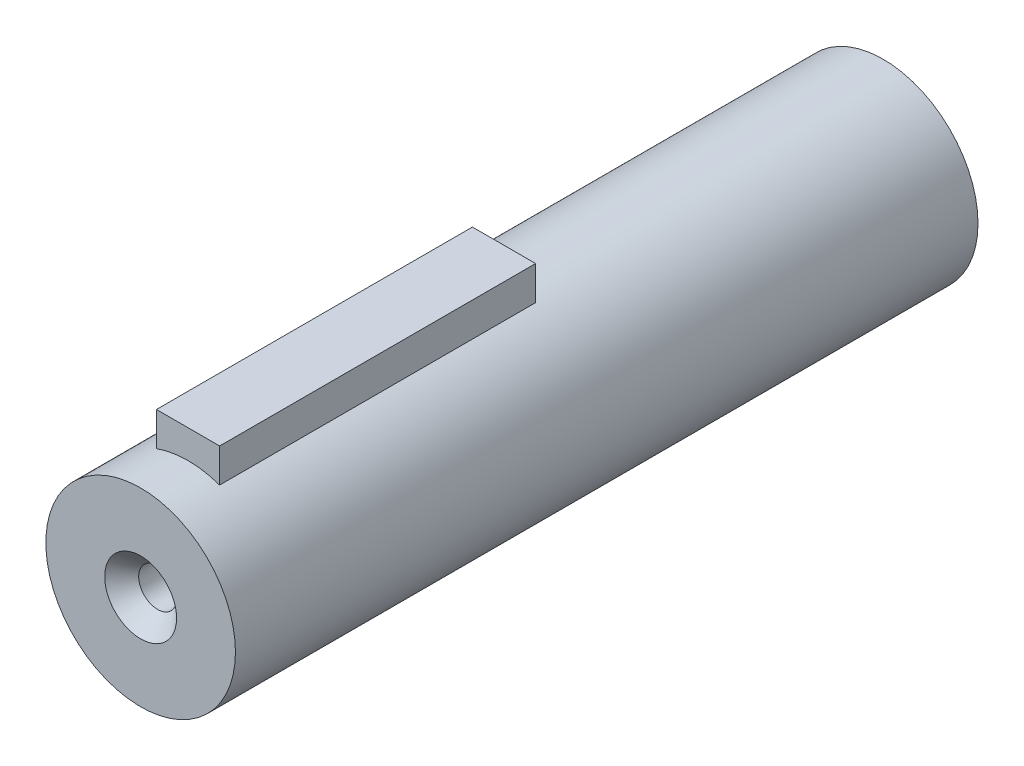
ISO-10303-21;
HEADER;
FILE_DESCRIPTION(('STEP AP214'),'2;1');
FILE_NAME('part.step','',(''),(''),'','','');
FILE_SCHEMA(('AUTOMOTIVE_DESIGN { 1 0 10303 214 1 1 1 1 }'));
ENDSEC;
DATA;
#1=APPLICATION_CONTEXT('core data for automotive mechanical design processes');
#2=APPLICATION_PROTOCOL_DEFINITION('international standard','automotive_design',2000,#1);
#3=PRODUCT_CONTEXT('',#1,'mechanical');
#4=PRODUCT('Part','Part','',(#3));
#5=PRODUCT_RELATED_PRODUCT_CATEGORY('part','',(#4));
#6=PRODUCT_DEFINITION_FORMATION('','',#4);
#7=PRODUCT_DEFINITION_CONTEXT('part definition',#1,'design');
#8=PRODUCT_DEFINITION('design','',#6,#7);
#9=PRODUCT_DEFINITION_SHAPE('','',#8);
#10=(LENGTH_UNIT() NAMED_UNIT(*) SI_UNIT(.MILLI.,.METRE.));
#11=(NAMED_UNIT(*) PLANE_ANGLE_UNIT() SI_UNIT($,.RADIAN.));
#12=(NAMED_UNIT(*) SI_UNIT($,.STERADIAN.) SOLID_ANGLE_UNIT());
#13=UNCERTAINTY_MEASURE_WITH_UNIT(LENGTH_MEASURE(1.E-05),#10,'distance_accuracy_value','');
#14=(GEOMETRIC_REPRESENTATION_CONTEXT(3) GLOBAL_UNCERTAINTY_ASSIGNED_CONTEXT((#13)) GLOBAL_UNIT_ASSIGNED_CONTEXT((#10,
#11,#12)) REPRESENTATION_CONTEXT('',''));
#15=CARTESIAN_POINT('',(0.,0.,0.));
#16=DIRECTION('',(0.,0.,1.));
#17=DIRECTION('',(1.,0.,0.));
#18=AXIS2_PLACEMENT_3D('',#15,#16,#17);
#19=CARTESIAN_POINT('',(0.,0.,47.));
#20=DIRECTION('',(0.,0.,-1.));
#21=DIRECTION('',(-1.,0.,0.));
#22=AXIS2_PLACEMENT_3D('',#19,#20,#21);
#23=CYLINDRICAL_SURFACE('',#22,6.);
#24=DIRECTION('',(0.,0.,-1.));
#25=VECTOR('',#24,1.);
#26=CARTESIAN_POINT('',(2.00000000000001,5.65685424949238,47.));
#27=LINE('',#26,#25);
#28=CARTESIAN_POINT('',(2.00000000000001,5.65685424949238,44.));
#29=VERTEX_POINT('',#28);
#30=CARTESIAN_POINT('',(2.00000000000001,5.65685424949238,24.));
#31=VERTEX_POINT('',#30);
#32=EDGE_CURVE('E108',#29,#31,#27,.T.);
#33=ORIENTED_EDGE('',*,*,#32,.F.);
#34=CARTESIAN_POINT('',(0.,0.,44.));
#35=DIRECTION('',(0.,0.,-1.));
#36=DIRECTION('',(-1.,0.,0.));
#37=AXIS2_PLACEMENT_3D('',#34,#35,#36);
#38=CIRCLE('',#37,6.);
#39=CARTESIAN_POINT('',(-1.99999999999999,5.65685424949238,44.));
#40=VERTEX_POINT('',#39);
#41=EDGE_CURVE('E109',#29,#40,#38,.F.);
#42=ORIENTED_EDGE('',*,*,#41,.T.);
#43=DIRECTION('',(0.,0.,-1.));
#44=VECTOR('',#43,1.);
#45=CARTESIAN_POINT('',(-1.99999999999999,5.65685424949238,47.));
#46=LINE('',#45,#44);
#47=CARTESIAN_POINT('',(-1.99999999999999,5.65685424949238,24.));
#48=VERTEX_POINT('',#47);
#49=EDGE_CURVE('E105',#40,#48,#46,.T.);
#50=ORIENTED_EDGE('',*,*,#49,.T.);
#51=CARTESIAN_POINT('',(0.,0.,24.));
#52=DIRECTION('',(0.,0.,-1.));
#53=DIRECTION('',(-1.,0.,0.));
#54=AXIS2_PLACEMENT_3D('',#51,#52,#53);
#55=CIRCLE('',#54,6.);
#56=EDGE_CURVE('E47',#31,#48,#55,.F.);
#57=ORIENTED_EDGE('',*,*,#56,.F.);
#58=EDGE_LOOP('',(#33,#42,#50,#57));
#59=FACE_BOUND('',#58,.T.);
#60=CARTESIAN_POINT('',(0.,0.,47.));
#61=DIRECTION('',(0.,0.,1.));
#62=DIRECTION('',(1.,0.,0.));
#63=AXIS2_PLACEMENT_3D('',#60,#61,#62);
#64=CIRCLE('',#63,6.);
#65=CARTESIAN_POINT('',(6.,0.,47.));
#66=VERTEX_POINT('',#65);
#67=EDGE_CURVE('E11',#66,#66,#64,.T.);
#68=ORIENTED_EDGE('',*,*,#67,.F.);
#69=EDGE_LOOP('',(#68));
#70=FACE_BOUND('',#69,.T.);
#71=CARTESIAN_POINT('',(0.,0.,0.));
#72=DIRECTION('',(0.,0.,1.));
#73=DIRECTION('',(1.,0.,0.));
#74=AXIS2_PLACEMENT_3D('',#71,#72,#73);
#75=CIRCLE('',#74,6.);
#76=CARTESIAN_POINT('',(6.,0.,0.));
#77=VERTEX_POINT('',#76);
#78=EDGE_CURVE('E36',#77,#77,#75,.T.);
#79=ORIENTED_EDGE('',*,*,#78,.T.);
#80=EDGE_LOOP('',(#79));
#81=FACE_BOUND('',#80,.T.);
#82=ADVANCED_FACE('F33',(#59,#70,#81),#23,.T.);
#83=CARTESIAN_POINT('',(0.,0.,47.));
#84=DIRECTION('',(0.,0.,1.));
#85=DIRECTION('',(1.,0.,0.));
#86=AXIS2_PLACEMENT_3D('',#83,#84,#85);
#87=PLANE('',#86);
#88=CARTESIAN_POINT('',(0.,0.,47.));
#89=DIRECTION('',(0.,0.,1.));
#90=DIRECTION('',(1.,0.,0.));
#91=AXIS2_PLACEMENT_3D('',#88,#89,#90);
#92=CIRCLE('',#91,2.275);
#93=CARTESIAN_POINT('',(2.275,0.,47.));
#94=VERTEX_POINT('',#93);
#95=EDGE_CURVE('E89',#94,#94,#92,.T.);
#96=ORIENTED_EDGE('',*,*,#95,.F.);
#97=EDGE_LOOP('',(#96));
#98=FACE_BOUND('',#97,.T.);
#99=ORIENTED_EDGE('',*,*,#67,.T.);
#100=EDGE_LOOP('',(#99));
#101=FACE_BOUND('',#100,.T.);
#102=ADVANCED_FACE('F155',(#98,#101),#87,.T.);
#103=CARTESIAN_POINT('',(0.,0.,0.));
#104=DIRECTION('',(0.,0.,1.));
#105=DIRECTION('',(1.,0.,0.));
#106=AXIS2_PLACEMENT_3D('',#103,#104,#105);
#107=PLANE('',#106);
#108=CARTESIAN_POINT('',(0.,0.,0.));
#109=DIRECTION('',(0.,0.,-1.));
#110=DIRECTION('',(-1.,0.,0.));
#111=AXIS2_PLACEMENT_3D('',#108,#109,#110);
#112=CIRCLE('',#111,2.275);
#113=CARTESIAN_POINT('',(-2.275,0.,0.));
#114=VERTEX_POINT('',#113);
#115=EDGE_CURVE('E96',#114,#114,#112,.T.);
#116=ORIENTED_EDGE('',*,*,#115,.F.);
#117=EDGE_LOOP('',(#116));
#118=FACE_BOUND('',#117,.T.);
#119=ORIENTED_EDGE('',*,*,#78,.F.);
#120=EDGE_LOOP('',(#119));
#121=FACE_BOUND('',#120,.T.);
#122=ADVANCED_FACE('F159',(#118,#121),#107,.F.);
#123=CARTESIAN_POINT('',(2.00000000000001,7.8,44.));
#124=DIRECTION('',(0.,0.,1.));
#125=DIRECTION('',(1.,0.,0.));
#126=AXIS2_PLACEMENT_3D('',#123,#124,#125);
#127=PLANE('',#126);
#128=DIRECTION('',(0.,-1.,0.));
#129=VECTOR('',#128,1.);
#130=CARTESIAN_POINT('',(-1.99999999999999,7.8,44.));
#131=LINE('',#130,#129);
#132=CARTESIAN_POINT('',(-1.99999999999999,7.8,44.));
#133=VERTEX_POINT('',#132);
#134=EDGE_CURVE('E124',#133,#40,#131,.T.);
#135=ORIENTED_EDGE('',*,*,#134,.T.);
#136=ORIENTED_EDGE('',*,*,#41,.F.);
#137=DIRECTION('',(0.,-1.,0.));
#138=VECTOR('',#137,1.);
#139=CARTESIAN_POINT('',(2.00000000000001,7.8,44.));
#140=LINE('',#139,#138);
#141=CARTESIAN_POINT('',(2.00000000000001,7.8,44.));
#142=VERTEX_POINT('',#141);
#143=EDGE_CURVE('E55',#142,#29,#140,.T.);
#144=ORIENTED_EDGE('',*,*,#143,.F.);
#145=DIRECTION('',(-1.,0.,0.));
#146=VECTOR('',#145,1.);
#147=CARTESIAN_POINT('',(2.00000000000001,7.8,44.));
#148=LINE('',#147,#146);
#149=EDGE_CURVE('E112',#142,#133,#148,.T.);
#150=ORIENTED_EDGE('',*,*,#149,.T.);
#151=EDGE_LOOP('',(#135,#136,#144,#150));
#152=FACE_BOUND('',#151,.T.);
#153=ADVANCED_FACE('F131',(#152),#127,.T.);
#154=CARTESIAN_POINT('',(2.00000000000001,7.8,44.));
#155=DIRECTION('',(-1.,0.,0.));
#156=DIRECTION('',(0.,0.,1.));
#157=AXIS2_PLACEMENT_3D('',#154,#155,#156);
#158=PLANE('',#157);
#159=ORIENTED_EDGE('',*,*,#143,.T.);
#160=ORIENTED_EDGE('',*,*,#32,.T.);
#161=DIRECTION('',(0.,-1.,0.));
#162=VECTOR('',#161,1.);
#163=CARTESIAN_POINT('',(2.,7.8,24.));
#164=LINE('',#163,#162);
#165=CARTESIAN_POINT('',(2.,7.8,24.));
#166=VERTEX_POINT('',#165);
#167=EDGE_CURVE('E126',#166,#31,#164,.T.);
#168=ORIENTED_EDGE('',*,*,#167,.F.);
#169=DIRECTION('',(0.,0.,-1.));
#170=VECTOR('',#169,1.);
#171=CARTESIAN_POINT('',(2.00000000000001,7.8,44.));
#172=LINE('',#171,#170);
#173=EDGE_CURVE('E122',#142,#166,#172,.T.);
#174=ORIENTED_EDGE('',*,*,#173,.F.);
#175=EDGE_LOOP('',(#159,#160,#168,#174));
#176=FACE_BOUND('',#175,.T.);
#177=ADVANCED_FACE('F141',(#176),#158,.F.);
#178=CARTESIAN_POINT('',(2.,7.8,24.));
#179=DIRECTION('',(0.,0.,1.));
#180=DIRECTION('',(1.,0.,0.));
#181=AXIS2_PLACEMENT_3D('',#178,#179,#180);
#182=PLANE('',#181);
#183=ORIENTED_EDGE('',*,*,#167,.T.);
#184=ORIENTED_EDGE('',*,*,#56,.T.);
#185=DIRECTION('',(0.,-1.,0.));
#186=VECTOR('',#185,1.);
#187=CARTESIAN_POINT('',(-2.,7.8,24.));
#188=LINE('',#187,#186);
#189=CARTESIAN_POINT('',(-2.,7.8,24.));
#190=VERTEX_POINT('',#189);
#191=EDGE_CURVE('E128',#190,#48,#188,.T.);
#192=ORIENTED_EDGE('',*,*,#191,.F.);
#193=DIRECTION('',(-1.,0.,0.));
#194=VECTOR('',#193,1.);
#195=CARTESIAN_POINT('',(2.,7.8,24.));
#196=LINE('',#195,#194);
#197=EDGE_CURVE('E120',#166,#190,#196,.T.);
#198=ORIENTED_EDGE('',*,*,#197,.F.);
#199=EDGE_LOOP('',(#183,#184,#192,#198));
#200=FACE_BOUND('',#199,.T.);
#201=ADVANCED_FACE('F145',(#200),#182,.F.);
#202=CARTESIAN_POINT('',(-1.99999999999999,7.8,44.));
#203=DIRECTION('',(-1.,0.,0.));
#204=DIRECTION('',(0.,0.,1.));
#205=AXIS2_PLACEMENT_3D('',#202,#203,#204);
#206=PLANE('',#205);
#207=ORIENTED_EDGE('',*,*,#191,.T.);
#208=ORIENTED_EDGE('',*,*,#49,.F.);
#209=ORIENTED_EDGE('',*,*,#134,.F.);
#210=DIRECTION('',(0.,0.,-1.));
#211=VECTOR('',#210,1.);
#212=CARTESIAN_POINT('',(-1.99999999999999,7.8,44.));
#213=LINE('',#212,#211);
#214=EDGE_CURVE('E117',#133,#190,#213,.T.);
#215=ORIENTED_EDGE('',*,*,#214,.T.);
#216=EDGE_LOOP('',(#207,#208,#209,#215));
#217=FACE_BOUND('',#216,.T.);
#218=ADVANCED_FACE('F136',(#217),#206,.T.);
#219=CARTESIAN_POINT('',(0.,7.8,0.));
#220=DIRECTION('',(0.,-1.,0.));
#221=DIRECTION('',(0.,0.,-1.));
#222=AXIS2_PLACEMENT_3D('',#219,#220,#221);
#223=PLANE('',#222);
#224=ORIENTED_EDGE('',*,*,#149,.F.);
#225=ORIENTED_EDGE('',*,*,#173,.T.);
#226=ORIENTED_EDGE('',*,*,#197,.T.);
#227=ORIENTED_EDGE('',*,*,#214,.F.);
#228=EDGE_LOOP('',(#224,#225,#226,#227));
#229=FACE_BOUND('',#228,.T.);
#230=ADVANCED_FACE('F144',(#229),#223,.F.);
#231=CARTESIAN_POINT('',(0.,0.,42.));
#232=DIRECTION('',(0.,0.,1.));
#233=DIRECTION('',(1.,0.,0.));
#234=AXIS2_PLACEMENT_3D('',#231,#232,#233);
#235=CONICAL_SURFACE('',#234,1.2,1.02974425867665);
#236=CARTESIAN_POINT('',(0.,0.,41.2789672571669));
#237=VERTEX_POINT('',#236);
#238=VERTEX_LOOP('',#237);
#239=FACE_BOUND('',#238,.T.);
#240=CARTESIAN_POINT('',(0.,0.,42.));
#241=DIRECTION('',(0.,0.,1.));
#242=DIRECTION('',(1.,0.,0.));
#243=AXIS2_PLACEMENT_3D('',#240,#241,#242);
#244=CIRCLE('',#243,1.2);
#245=CARTESIAN_POINT('',(1.2,0.,42.));
#246=VERTEX_POINT('',#245);
#247=EDGE_CURVE('E102',#246,#246,#244,.T.);
#248=ORIENTED_EDGE('',*,*,#247,.T.);
#249=EDGE_LOOP('',(#248));
#250=FACE_BOUND('',#249,.T.);
#251=ADVANCED_FACE('F196',(#239,#250),#235,.F.);
#252=CARTESIAN_POINT('',(0.,0.,47.));
#253=DIRECTION('',(0.,0.,1.));
#254=DIRECTION('',(1.,0.,0.));
#255=AXIS2_PLACEMENT_3D('',#252,#253,#254);
#256=CYLINDRICAL_SURFACE('',#255,1.19999999999999);
#257=ORIENTED_EDGE('',*,*,#247,.F.);
#258=EDGE_LOOP('',(#257));
#259=FACE_BOUND('',#258,.T.);
#260=CARTESIAN_POINT('',(0.,0.,45.925));
#261=DIRECTION('',(0.,0.,1.));
#262=DIRECTION('',(1.,0.,0.));
#263=AXIS2_PLACEMENT_3D('',#260,#261,#262);
#264=CIRCLE('',#263,1.19999999999999);
#265=CARTESIAN_POINT('',(1.19999999999999,0.,45.925));
#266=VERTEX_POINT('',#265);
#267=EDGE_CURVE('E93',#266,#266,#264,.T.);
#268=ORIENTED_EDGE('',*,*,#267,.T.);
#269=EDGE_LOOP('',(#268));
#270=FACE_BOUND('',#269,.T.);
#271=ADVANCED_FACE('F212',(#259,#270),#256,.F.);
#272=CARTESIAN_POINT('',(0.,0.,47.));
#273=DIRECTION('',(0.,0.,1.));
#274=DIRECTION('',(1.,0.,0.));
#275=AXIS2_PLACEMENT_3D('',#272,#273,#274);
#276=CONICAL_SURFACE('',#275,2.275,0.785398163397444);
#277=ORIENTED_EDGE('',*,*,#267,.F.);
#278=EDGE_LOOP('',(#277));
#279=FACE_BOUND('',#278,.T.);
#280=ORIENTED_EDGE('',*,*,#95,.T.);
#281=EDGE_LOOP('',(#280));
#282=FACE_BOUND('',#281,.T.);
#283=ADVANCED_FACE('F83',(#279,#282),#276,.F.);
#284=CARTESIAN_POINT('',(0.,0.,5.));
#285=DIRECTION('',(0.,0.,-1.));
#286=DIRECTION('',(-1.,0.,0.));
#287=AXIS2_PLACEMENT_3D('',#284,#285,#286);
#288=CONICAL_SURFACE('',#287,1.19999999999999,1.02974425867665);
#289=CARTESIAN_POINT('',(0.,0.,5.72103274283307));
#290=VERTEX_POINT('',#289);
#291=VERTEX_LOOP('',#290);
#292=FACE_BOUND('',#291,.T.);
#293=CARTESIAN_POINT('',(0.,0.,5.));
#294=DIRECTION('',(0.,0.,-1.));
#295=DIRECTION('',(-1.,0.,0.));
#296=AXIS2_PLACEMENT_3D('',#293,#294,#295);
#297=CIRCLE('',#296,1.19999999999999);
#298=CARTESIAN_POINT('',(-1.19999999999999,0.,5.));
#299=VERTEX_POINT('',#298);
#300=EDGE_CURVE('E87',#299,#299,#297,.T.);
#301=ORIENTED_EDGE('',*,*,#300,.T.);
#302=EDGE_LOOP('',(#301));
#303=FACE_BOUND('',#302,.T.);
#304=ADVANCED_FACE('F79',(#292,#303),#288,.F.);
#305=CARTESIAN_POINT('',(0.,0.,0.));
#306=DIRECTION('',(0.,0.,-1.));
#307=DIRECTION('',(-1.,0.,0.));
#308=AXIS2_PLACEMENT_3D('',#305,#306,#307);
#309=CYLINDRICAL_SURFACE('',#308,1.19999999999999);
#310=ORIENTED_EDGE('',*,*,#300,.F.);
#311=EDGE_LOOP('',(#310));
#312=FACE_BOUND('',#311,.T.);
#313=CARTESIAN_POINT('',(0.,0.,1.07500000000002));
#314=DIRECTION('',(0.,0.,-1.));
#315=DIRECTION('',(-1.,0.,0.));
#316=AXIS2_PLACEMENT_3D('',#313,#314,#315);
#317=CIRCLE('',#316,1.19999999999999);
#318=CARTESIAN_POINT('',(-1.19999999999999,0.,1.07500000000002));
#319=VERTEX_POINT('',#318);
#320=EDGE_CURVE('E90',#319,#319,#317,.T.);
#321=ORIENTED_EDGE('',*,*,#320,.T.);
#322=EDGE_LOOP('',(#321));
#323=FACE_BOUND('',#322,.T.);
#324=ADVANCED_FACE('F82',(#312,#323),#309,.F.);
#325=CARTESIAN_POINT('',(0.,0.,0.));
#326=DIRECTION('',(0.,0.,-1.));
#327=DIRECTION('',(-1.,0.,0.));
#328=AXIS2_PLACEMENT_3D('',#325,#326,#327);
#329=CONICAL_SURFACE('',#328,2.275,0.785398163397444);
#330=ORIENTED_EDGE('',*,*,#320,.F.);
#331=EDGE_LOOP('',(#330));
#332=FACE_BOUND('',#331,.T.);
#333=ORIENTED_EDGE('',*,*,#115,.T.);
#334=EDGE_LOOP('',(#333));
#335=FACE_BOUND('',#334,.T.);
#336=ADVANCED_FACE('F249',(#332,#335),#329,.F.);
#337=CLOSED_SHELL('',(#82,#102,#122,#153,#177,#201,#218,#230,#251,#271,#283,#304,#324,#336));
#338=MANIFOLD_SOLID_BREP('B2',#337);
#339=ADVANCED_BREP_SHAPE_REPRESENTATION('',(#18,#338),#14);
#340=SHAPE_DEFINITION_REPRESENTATION(#9,#339);
ENDSEC;
END-ISO-10303-21;
